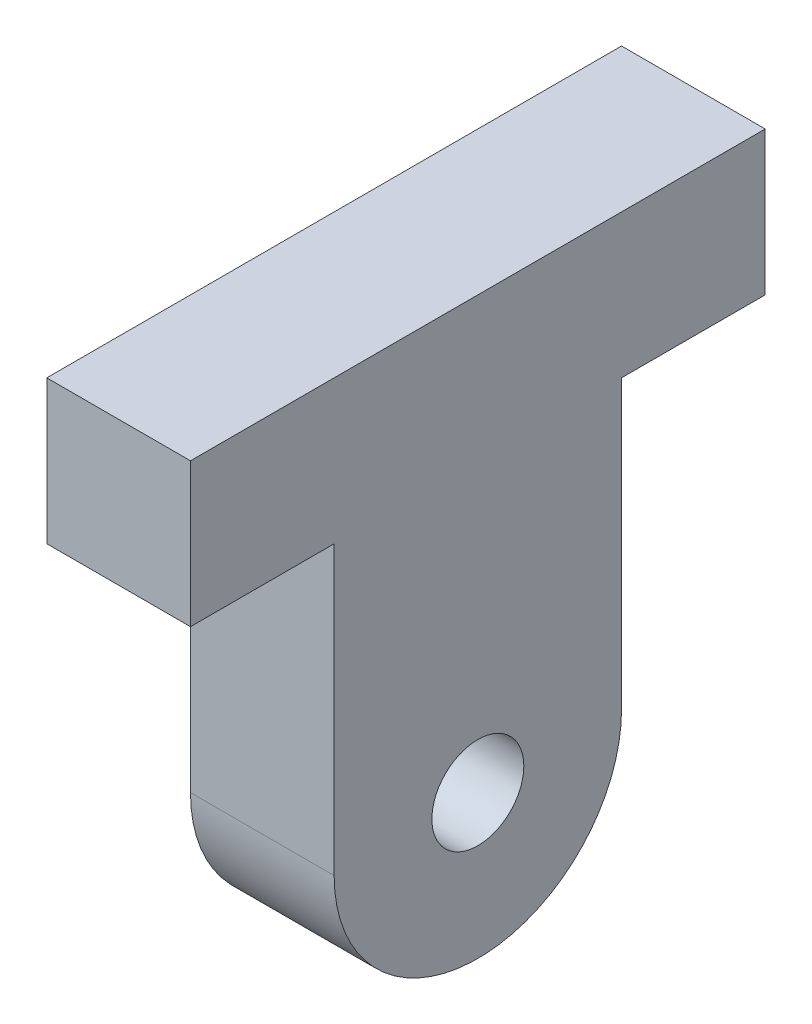
ISO-10303-21;
HEADER;
FILE_DESCRIPTION(('STEP AP214'),'2;1');
FILE_NAME('part.step','',(''),(''),'','','');
FILE_SCHEMA(('AUTOMOTIVE_DESIGN { 1 0 10303 214 1 1 1 1 }'));
ENDSEC;
DATA;
#1=APPLICATION_CONTEXT('core data for automotive mechanical design processes');
#2=APPLICATION_PROTOCOL_DEFINITION('international standard','automotive_design',2000,#1);
#3=PRODUCT_CONTEXT('',#1,'mechanical');
#4=PRODUCT('Part','Part','',(#3));
#5=PRODUCT_RELATED_PRODUCT_CATEGORY('part','',(#4));
#6=PRODUCT_DEFINITION_FORMATION('','',#4);
#7=PRODUCT_DEFINITION_CONTEXT('part definition',#1,'design');
#8=PRODUCT_DEFINITION('design','',#6,#7);
#9=PRODUCT_DEFINITION_SHAPE('','',#8);
#10=(LENGTH_UNIT() NAMED_UNIT(*) SI_UNIT(.MILLI.,.METRE.));
#11=(NAMED_UNIT(*) PLANE_ANGLE_UNIT() SI_UNIT($,.RADIAN.));
#12=(NAMED_UNIT(*) SI_UNIT($,.STERADIAN.) SOLID_ANGLE_UNIT());
#13=UNCERTAINTY_MEASURE_WITH_UNIT(LENGTH_MEASURE(1.E-05),#10,'distance_accuracy_value','');
#14=(GEOMETRIC_REPRESENTATION_CONTEXT(3) GLOBAL_UNCERTAINTY_ASSIGNED_CONTEXT((#13)) GLOBAL_UNIT_ASSIGNED_CONTEXT((#10,
#11,#12)) REPRESENTATION_CONTEXT('',''));
#15=CARTESIAN_POINT('',(0.,0.,0.));
#16=DIRECTION('',(0.,0.,1.));
#17=DIRECTION('',(1.,0.,0.));
#18=AXIS2_PLACEMENT_3D('',#15,#16,#17);
#19=CARTESIAN_POINT('',(5.,-15.,-10.));
#20=DIRECTION('',(-1.,0.,0.));
#21=DIRECTION('',(0.,0.,1.));
#22=AXIS2_PLACEMENT_3D('',#19,#20,#21);
#23=PLANE('',#22);
#24=DIRECTION('',(0.,-1.,0.));
#25=VECTOR('',#24,1.);
#26=CARTESIAN_POINT('',(5.,-5.,0.));
#27=LINE('',#26,#25);
#28=CARTESIAN_POINT('',(5.,0.,0.));
#29=VERTEX_POINT('',#28);
#30=CARTESIAN_POINT('',(5.,-5.,0.));
#31=VERTEX_POINT('',#30);
#32=EDGE_CURVE('E147',#29,#31,#27,.T.);
#33=ORIENTED_EDGE('',*,*,#32,.T.);
#34=DIRECTION('',(0.,0.,-1.));
#35=VECTOR('',#34,1.);
#36=CARTESIAN_POINT('',(5.,-5.,-5.));
#37=LINE('',#36,#35);
#38=CARTESIAN_POINT('',(5.,-5.,-5.));
#39=VERTEX_POINT('',#38);
#40=EDGE_CURVE('E95',#31,#39,#37,.T.);
#41=ORIENTED_EDGE('',*,*,#40,.T.);
#42=DIRECTION('',(0.,-1.,0.));
#43=VECTOR('',#42,1.);
#44=CARTESIAN_POINT('',(5.,-15.,-5.));
#45=LINE('',#44,#43);
#46=CARTESIAN_POINT('',(5.,-15.,-5.));
#47=VERTEX_POINT('',#46);
#48=EDGE_CURVE('E162',#39,#47,#45,.T.);
#49=ORIENTED_EDGE('',*,*,#48,.T.);
#50=CARTESIAN_POINT('',(5.,-15.,-10.));
#51=DIRECTION('',(1.,0.,0.));
#52=DIRECTION('',(0.,0.,1.));
#53=AXIS2_PLACEMENT_3D('',#50,#51,#52);
#54=CIRCLE('',#53,5.);
#55=CARTESIAN_POINT('',(5.,-15.,-15.));
#56=VERTEX_POINT('',#55);
#57=EDGE_CURVE('E175',#47,#56,#54,.T.);
#58=ORIENTED_EDGE('',*,*,#57,.T.);
#59=DIRECTION('',(0.,1.,0.));
#60=VECTOR('',#59,1.);
#61=CARTESIAN_POINT('',(5.,-5.,-15.));
#62=LINE('',#61,#60);
#63=CARTESIAN_POINT('',(5.,-5.,-15.));
#64=VERTEX_POINT('',#63);
#65=EDGE_CURVE('E114',#56,#64,#62,.T.);
#66=ORIENTED_EDGE('',*,*,#65,.T.);
#67=DIRECTION('',(0.,0.,-1.));
#68=VECTOR('',#67,1.);
#69=CARTESIAN_POINT('',(5.,-5.,-20.));
#70=LINE('',#69,#68);
#71=CARTESIAN_POINT('',(5.,-5.,-20.));
#72=VERTEX_POINT('',#71);
#73=EDGE_CURVE('E108',#64,#72,#70,.T.);
#74=ORIENTED_EDGE('',*,*,#73,.T.);
#75=DIRECTION('',(0.,1.,0.));
#76=VECTOR('',#75,1.);
#77=CARTESIAN_POINT('',(5.,0.,-20.));
#78=LINE('',#77,#76);
#79=CARTESIAN_POINT('',(5.,0.,-20.));
#80=VERTEX_POINT('',#79);
#81=EDGE_CURVE('E112',#72,#80,#78,.T.);
#82=ORIENTED_EDGE('',*,*,#81,.T.);
#83=DIRECTION('',(0.,0.,1.));
#84=VECTOR('',#83,1.);
#85=CARTESIAN_POINT('',(5.,0.,0.));
#86=LINE('',#85,#84);
#87=EDGE_CURVE('E52',#80,#29,#86,.T.);
#88=ORIENTED_EDGE('',*,*,#87,.T.);
#89=EDGE_LOOP('',(#33,#41,#49,#58,#66,#74,#82,#88));
#90=FACE_BOUND('',#89,.T.);
#91=CARTESIAN_POINT('',(5.,-15.,-10.));
#92=DIRECTION('',(1.,0.,0.));
#93=DIRECTION('',(0.,0.,-1.));
#94=AXIS2_PLACEMENT_3D('',#91,#92,#93);
#95=CIRCLE('',#94,1.6);
#96=CARTESIAN_POINT('',(5.,-15.,-11.6));
#97=VERTEX_POINT('',#96);
#98=EDGE_CURVE('E136',#97,#97,#95,.T.);
#99=ORIENTED_EDGE('',*,*,#98,.F.);
#100=EDGE_LOOP('',(#99));
#101=FACE_BOUND('',#100,.T.);
#102=ADVANCED_FACE('F35',(#90,#101),#23,.F.);
#103=CARTESIAN_POINT('',(0.,-15.,-10.));
#104=DIRECTION('',(-1.,0.,0.));
#105=DIRECTION('',(0.,0.,1.));
#106=AXIS2_PLACEMENT_3D('',#103,#104,#105);
#107=PLANE('',#106);
#108=DIRECTION('',(0.,-1.,0.));
#109=VECTOR('',#108,1.);
#110=CARTESIAN_POINT('',(0.,-5.,0.));
#111=LINE('',#110,#109);
#112=CARTESIAN_POINT('',(0.,0.,0.));
#113=VERTEX_POINT('',#112);
#114=CARTESIAN_POINT('',(0.,-5.,0.));
#115=VERTEX_POINT('',#114);
#116=EDGE_CURVE('E132',#113,#115,#111,.T.);
#117=ORIENTED_EDGE('',*,*,#116,.F.);
#118=DIRECTION('',(0.,0.,1.));
#119=VECTOR('',#118,1.);
#120=CARTESIAN_POINT('',(0.,0.,0.));
#121=LINE('',#120,#119);
#122=CARTESIAN_POINT('',(0.,0.,-20.));
#123=VERTEX_POINT('',#122);
#124=EDGE_CURVE('E87',#123,#113,#121,.T.);
#125=ORIENTED_EDGE('',*,*,#124,.F.);
#126=DIRECTION('',(0.,1.,0.));
#127=VECTOR('',#126,1.);
#128=CARTESIAN_POINT('',(0.,0.,-20.));
#129=LINE('',#128,#127);
#130=CARTESIAN_POINT('',(0.,-5.,-20.));
#131=VERTEX_POINT('',#130);
#132=EDGE_CURVE('E81',#131,#123,#129,.T.);
#133=ORIENTED_EDGE('',*,*,#132,.F.);
#134=DIRECTION('',(0.,0.,-1.));
#135=VECTOR('',#134,1.);
#136=CARTESIAN_POINT('',(0.,-5.,-20.));
#137=LINE('',#136,#135);
#138=CARTESIAN_POINT('',(0.,-5.,-15.));
#139=VERTEX_POINT('',#138);
#140=EDGE_CURVE('E122',#139,#131,#137,.T.);
#141=ORIENTED_EDGE('',*,*,#140,.F.);
#142=DIRECTION('',(0.,1.,0.));
#143=VECTOR('',#142,1.);
#144=CARTESIAN_POINT('',(0.,-5.,-15.));
#145=LINE('',#144,#143);
#146=CARTESIAN_POINT('',(0.,-15.,-15.));
#147=VERTEX_POINT('',#146);
#148=EDGE_CURVE('E142',#147,#139,#145,.T.);
#149=ORIENTED_EDGE('',*,*,#148,.F.);
#150=CARTESIAN_POINT('',(0.,-15.,-10.));
#151=DIRECTION('',(1.,0.,0.));
#152=DIRECTION('',(0.,0.,1.));
#153=AXIS2_PLACEMENT_3D('',#150,#151,#152);
#154=CIRCLE('',#153,5.);
#155=CARTESIAN_POINT('',(0.,-15.,-5.));
#156=VERTEX_POINT('',#155);
#157=EDGE_CURVE('E140',#156,#147,#154,.T.);
#158=ORIENTED_EDGE('',*,*,#157,.F.);
#159=DIRECTION('',(0.,-1.,0.));
#160=VECTOR('',#159,1.);
#161=CARTESIAN_POINT('',(0.,-15.,-5.));
#162=LINE('',#161,#160);
#163=CARTESIAN_POINT('',(0.,-5.,-5.));
#164=VERTEX_POINT('',#163);
#165=EDGE_CURVE('E138',#164,#156,#162,.T.);
#166=ORIENTED_EDGE('',*,*,#165,.F.);
#167=DIRECTION('',(0.,0.,-1.));
#168=VECTOR('',#167,1.);
#169=CARTESIAN_POINT('',(0.,-5.,-5.));
#170=LINE('',#169,#168);
#171=EDGE_CURVE('E135',#115,#164,#170,.T.);
#172=ORIENTED_EDGE('',*,*,#171,.F.);
#173=EDGE_LOOP('',(#117,#125,#133,#141,#149,#158,#166,#172));
#174=FACE_BOUND('',#173,.T.);
#175=CARTESIAN_POINT('',(0.,-15.,-10.));
#176=DIRECTION('',(1.,0.,0.));
#177=DIRECTION('',(0.,0.,-1.));
#178=AXIS2_PLACEMENT_3D('',#175,#176,#177);
#179=CIRCLE('',#178,1.6);
#180=CARTESIAN_POINT('',(0.,-15.,-11.6));
#181=VERTEX_POINT('',#180);
#182=EDGE_CURVE('E181',#181,#181,#179,.T.);
#183=ORIENTED_EDGE('',*,*,#182,.T.);
#184=EDGE_LOOP('',(#183));
#185=FACE_BOUND('',#184,.T.);
#186=ADVANCED_FACE('F166',(#174,#185),#107,.T.);
#187=CARTESIAN_POINT('',(5.,-5.,0.));
#188=DIRECTION('',(0.,0.,-1.));
#189=DIRECTION('',(-1.,0.,0.));
#190=AXIS2_PLACEMENT_3D('',#187,#188,#189);
#191=PLANE('',#190);
#192=ORIENTED_EDGE('',*,*,#116,.T.);
#193=DIRECTION('',(-1.,0.,0.));
#194=VECTOR('',#193,1.);
#195=CARTESIAN_POINT('',(5.,-5.,0.));
#196=LINE('',#195,#194);
#197=EDGE_CURVE('E11',#31,#115,#196,.T.);
#198=ORIENTED_EDGE('',*,*,#197,.F.);
#199=ORIENTED_EDGE('',*,*,#32,.F.);
#200=DIRECTION('',(-1.,0.,0.));
#201=VECTOR('',#200,1.);
#202=CARTESIAN_POINT('',(5.,0.,0.));
#203=LINE('',#202,#201);
#204=EDGE_CURVE('E128',#29,#113,#203,.T.);
#205=ORIENTED_EDGE('',*,*,#204,.T.);
#206=EDGE_LOOP('',(#192,#198,#199,#205));
#207=FACE_BOUND('',#206,.T.);
#208=ADVANCED_FACE('F37',(#207),#191,.F.);
#209=CARTESIAN_POINT('',(5.,-5.,-5.));
#210=DIRECTION('',(0.,1.,0.));
#211=DIRECTION('',(0.,0.,1.));
#212=AXIS2_PLACEMENT_3D('',#209,#210,#211);
#213=PLANE('',#212);
#214=ORIENTED_EDGE('',*,*,#171,.T.);
#215=DIRECTION('',(-1.,0.,0.));
#216=VECTOR('',#215,1.);
#217=CARTESIAN_POINT('',(5.,-5.,-5.));
#218=LINE('',#217,#216);
#219=EDGE_CURVE('E44',#39,#164,#218,.T.);
#220=ORIENTED_EDGE('',*,*,#219,.F.);
#221=ORIENTED_EDGE('',*,*,#40,.F.);
#222=ORIENTED_EDGE('',*,*,#197,.T.);
#223=EDGE_LOOP('',(#214,#220,#221,#222));
#224=FACE_BOUND('',#223,.T.);
#225=ADVANCED_FACE('F209',(#224),#213,.F.);
#226=CARTESIAN_POINT('',(5.,-15.,-5.));
#227=DIRECTION('',(0.,0.,-1.));
#228=DIRECTION('',(0.,1.,0.));
#229=AXIS2_PLACEMENT_3D('',#226,#227,#228);
#230=PLANE('',#229);
#231=ORIENTED_EDGE('',*,*,#165,.T.);
#232=DIRECTION('',(-1.,0.,0.));
#233=VECTOR('',#232,1.);
#234=CARTESIAN_POINT('',(5.,-15.,-5.));
#235=LINE('',#234,#233);
#236=EDGE_CURVE('E154',#47,#156,#235,.T.);
#237=ORIENTED_EDGE('',*,*,#236,.F.);
#238=ORIENTED_EDGE('',*,*,#48,.F.);
#239=ORIENTED_EDGE('',*,*,#219,.T.);
#240=EDGE_LOOP('',(#231,#237,#238,#239));
#241=FACE_BOUND('',#240,.T.);
#242=ADVANCED_FACE('F160',(#241),#230,.F.);
#243=CARTESIAN_POINT('',(5.,-15.,-10.));
#244=DIRECTION('',(-1.,0.,0.));
#245=DIRECTION('',(0.,0.,1.));
#246=AXIS2_PLACEMENT_3D('',#243,#244,#245);
#247=CYLINDRICAL_SURFACE('',#246,5.);
#248=ORIENTED_EDGE('',*,*,#157,.T.);
#249=DIRECTION('',(-1.,0.,0.));
#250=VECTOR('',#249,1.);
#251=CARTESIAN_POINT('',(5.,-15.,-15.));
#252=LINE('',#251,#250);
#253=EDGE_CURVE('E151',#56,#147,#252,.T.);
#254=ORIENTED_EDGE('',*,*,#253,.F.);
#255=ORIENTED_EDGE('',*,*,#57,.F.);
#256=ORIENTED_EDGE('',*,*,#236,.T.);
#257=EDGE_LOOP('',(#248,#254,#255,#256));
#258=FACE_BOUND('',#257,.T.);
#259=ADVANCED_FACE('F171',(#258),#247,.T.);
#260=CARTESIAN_POINT('',(5.,-5.,-15.));
#261=DIRECTION('',(0.,0.,1.));
#262=DIRECTION('',(0.,-1.,0.));
#263=AXIS2_PLACEMENT_3D('',#260,#261,#262);
#264=PLANE('',#263);
#265=ORIENTED_EDGE('',*,*,#148,.T.);
#266=DIRECTION('',(-1.,0.,0.));
#267=VECTOR('',#266,1.);
#268=CARTESIAN_POINT('',(5.,-5.,-15.));
#269=LINE('',#268,#267);
#270=EDGE_CURVE('E123',#64,#139,#269,.T.);
#271=ORIENTED_EDGE('',*,*,#270,.F.);
#272=ORIENTED_EDGE('',*,*,#65,.F.);
#273=ORIENTED_EDGE('',*,*,#253,.T.);
#274=EDGE_LOOP('',(#265,#271,#272,#273));
#275=FACE_BOUND('',#274,.T.);
#276=ADVANCED_FACE('F174',(#275),#264,.F.);
#277=CARTESIAN_POINT('',(5.,-5.,-20.));
#278=DIRECTION('',(0.,1.,0.));
#279=DIRECTION('',(0.,0.,1.));
#280=AXIS2_PLACEMENT_3D('',#277,#278,#279);
#281=PLANE('',#280);
#282=ORIENTED_EDGE('',*,*,#140,.T.);
#283=DIRECTION('',(-1.,0.,0.));
#284=VECTOR('',#283,1.);
#285=CARTESIAN_POINT('',(5.,-5.,-20.));
#286=LINE('',#285,#284);
#287=EDGE_CURVE('E119',#72,#131,#286,.T.);
#288=ORIENTED_EDGE('',*,*,#287,.F.);
#289=ORIENTED_EDGE('',*,*,#73,.F.);
#290=ORIENTED_EDGE('',*,*,#270,.T.);
#291=EDGE_LOOP('',(#282,#288,#289,#290));
#292=FACE_BOUND('',#291,.T.);
#293=ADVANCED_FACE('F120',(#292),#281,.F.);
#294=CARTESIAN_POINT('',(5.,0.,-20.));
#295=DIRECTION('',(0.,0.,1.));
#296=DIRECTION('',(1.,0.,0.));
#297=AXIS2_PLACEMENT_3D('',#294,#295,#296);
#298=PLANE('',#297);
#299=ORIENTED_EDGE('',*,*,#132,.T.);
#300=DIRECTION('',(-1.,0.,0.));
#301=VECTOR('',#300,1.);
#302=CARTESIAN_POINT('',(5.,0.,-20.));
#303=LINE('',#302,#301);
#304=EDGE_CURVE('E124',#80,#123,#303,.T.);
#305=ORIENTED_EDGE('',*,*,#304,.F.);
#306=ORIENTED_EDGE('',*,*,#81,.F.);
#307=ORIENTED_EDGE('',*,*,#287,.T.);
#308=EDGE_LOOP('',(#299,#305,#306,#307));
#309=FACE_BOUND('',#308,.T.);
#310=ADVANCED_FACE('F126',(#309),#298,.F.);
#311=CARTESIAN_POINT('',(5.,0.,0.));
#312=DIRECTION('',(0.,-1.,0.));
#313=DIRECTION('',(0.,0.,-1.));
#314=AXIS2_PLACEMENT_3D('',#311,#312,#313);
#315=PLANE('',#314);
#316=ORIENTED_EDGE('',*,*,#124,.T.);
#317=ORIENTED_EDGE('',*,*,#204,.F.);
#318=ORIENTED_EDGE('',*,*,#87,.F.);
#319=ORIENTED_EDGE('',*,*,#304,.T.);
#320=EDGE_LOOP('',(#316,#317,#318,#319));
#321=FACE_BOUND('',#320,.T.);
#322=ADVANCED_FACE('F197',(#321),#315,.F.);
#323=CARTESIAN_POINT('',(5.,-15.,-10.));
#324=DIRECTION('',(-1.,0.,0.));
#325=DIRECTION('',(0.,0.,1.));
#326=AXIS2_PLACEMENT_3D('',#323,#324,#325);
#327=CYLINDRICAL_SURFACE('',#326,1.6);
#328=ORIENTED_EDGE('',*,*,#98,.T.);
#329=EDGE_LOOP('',(#328));
#330=FACE_BOUND('',#329,.T.);
#331=ORIENTED_EDGE('',*,*,#182,.F.);
#332=EDGE_LOOP('',(#331));
#333=FACE_BOUND('',#332,.T.);
#334=ADVANCED_FACE('F187',(#330,#333),#327,.F.);
#335=CLOSED_SHELL('',(#102,#186,#208,#225,#242,#259,#276,#293,#310,#322,#334));
#336=MANIFOLD_SOLID_BREP('B2',#335);
#337=ADVANCED_BREP_SHAPE_REPRESENTATION('',(#18,#336),#14);
#338=SHAPE_DEFINITION_REPRESENTATION(#9,#337);
ENDSEC;
END-ISO-10303-21;
